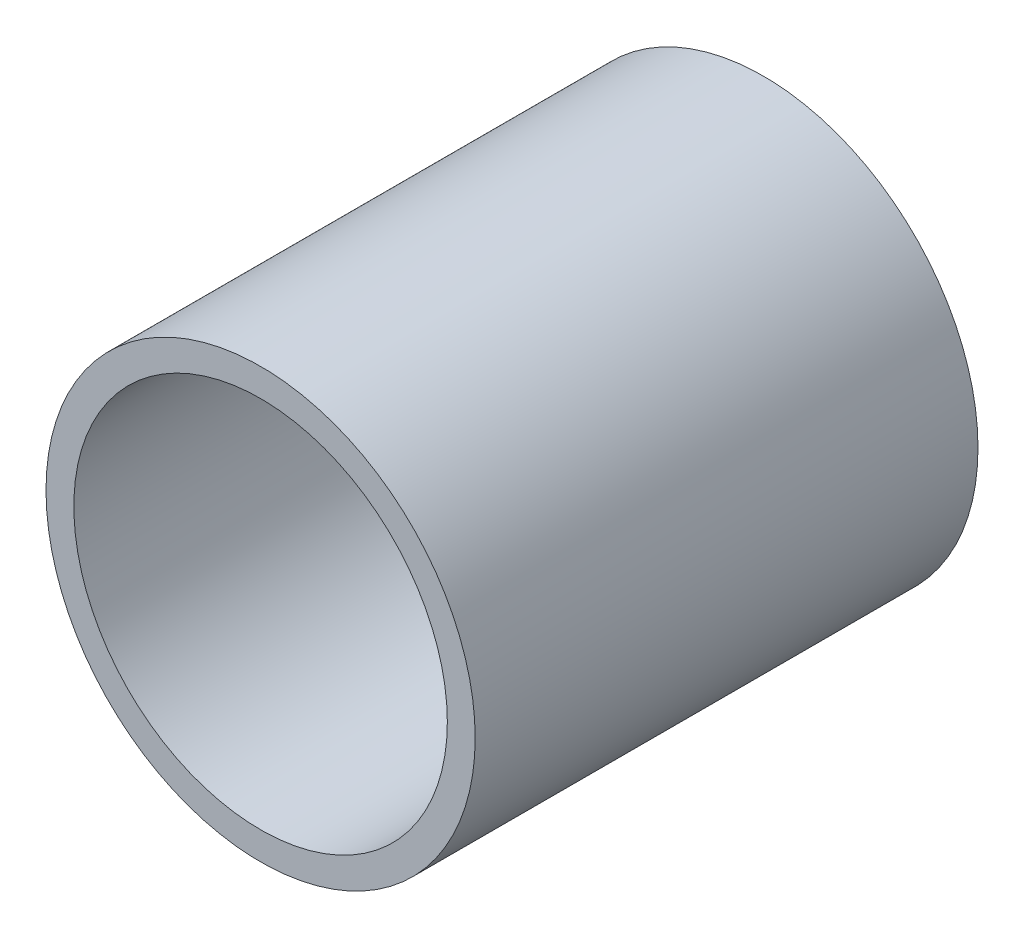
ISO-10303-21;
HEADER;
FILE_DESCRIPTION(('STEP AP214'),'2;1');
FILE_NAME('part.step','',(''),(''),'','','');
FILE_SCHEMA(('AUTOMOTIVE_DESIGN { 1 0 10303 214 1 1 1 1 }'));
ENDSEC;
DATA;
#1=APPLICATION_CONTEXT('core data for automotive mechanical design processes');
#2=APPLICATION_PROTOCOL_DEFINITION('international standard','automotive_design',2000,#1);
#3=PRODUCT_CONTEXT('',#1,'mechanical');
#4=PRODUCT('Part','Part','',(#3));
#5=PRODUCT_RELATED_PRODUCT_CATEGORY('part','',(#4));
#6=PRODUCT_DEFINITION_FORMATION('','',#4);
#7=PRODUCT_DEFINITION_CONTEXT('part definition',#1,'design');
#8=PRODUCT_DEFINITION('design','',#6,#7);
#9=PRODUCT_DEFINITION_SHAPE('','',#8);
#10=(LENGTH_UNIT() NAMED_UNIT(*) SI_UNIT(.MILLI.,.METRE.));
#11=(NAMED_UNIT(*) PLANE_ANGLE_UNIT() SI_UNIT($,.RADIAN.));
#12=(NAMED_UNIT(*) SI_UNIT($,.STERADIAN.) SOLID_ANGLE_UNIT());
#13=UNCERTAINTY_MEASURE_WITH_UNIT(LENGTH_MEASURE(1.E-05),#10,'distance_accuracy_value','');
#14=(GEOMETRIC_REPRESENTATION_CONTEXT(3) GLOBAL_UNCERTAINTY_ASSIGNED_CONTEXT((#13)) GLOBAL_UNIT_ASSIGNED_CONTEXT((#10,
#11,#12)) REPRESENTATION_CONTEXT('',''));
#15=CARTESIAN_POINT('',(0.,0.,0.));
#16=DIRECTION('',(0.,0.,1.));
#17=DIRECTION('',(1.,0.,0.));
#18=AXIS2_PLACEMENT_3D('',#15,#16,#17);
#19=CARTESIAN_POINT('',(0.,0.,17.77));
#20=DIRECTION('',(0.,0.,1.));
#21=DIRECTION('',(1.,0.,0.));
#22=AXIS2_PLACEMENT_3D('',#19,#20,#21);
#23=PLANE('',#22);
#24=CARTESIAN_POINT('',(0.,0.,17.77));
#25=DIRECTION('',(0.,0.,1.));
#26=DIRECTION('',(1.,0.,0.));
#27=AXIS2_PLACEMENT_3D('',#24,#25,#26);
#28=CIRCLE('',#27,7.584);
#29=CARTESIAN_POINT('',(7.584,0.,17.77));
#30=VERTEX_POINT('',#29);
#31=EDGE_CURVE('E10',#30,#30,#28,.T.);
#32=ORIENTED_EDGE('',*,*,#31,.T.);
#33=EDGE_LOOP('',(#32));
#34=FACE_BOUND('',#33,.T.);
#35=CARTESIAN_POINT('',(0.,0.,17.77));
#36=DIRECTION('',(0.,0.,1.));
#37=DIRECTION('',(1.,0.,0.));
#38=AXIS2_PLACEMENT_3D('',#35,#36,#37);
#39=CIRCLE('',#38,6.6);
#40=CARTESIAN_POINT('',(6.6,0.,17.77));
#41=VERTEX_POINT('',#40);
#42=EDGE_CURVE('E54',#41,#41,#39,.T.);
#43=ORIENTED_EDGE('',*,*,#42,.F.);
#44=EDGE_LOOP('',(#43));
#45=FACE_BOUND('',#44,.T.);
#46=ADVANCED_FACE('F41',(#34,#45),#23,.T.);
#47=CARTESIAN_POINT('',(0.,0.,0.));
#48=DIRECTION('',(0.,0.,1.));
#49=DIRECTION('',(1.,0.,0.));
#50=AXIS2_PLACEMENT_3D('',#47,#48,#49);
#51=PLANE('',#50);
#52=CARTESIAN_POINT('',(0.,0.,0.));
#53=DIRECTION('',(0.,0.,1.));
#54=DIRECTION('',(1.,0.,0.));
#55=AXIS2_PLACEMENT_3D('',#52,#53,#54);
#56=CIRCLE('',#55,7.584);
#57=CARTESIAN_POINT('',(7.584,0.,0.));
#58=VERTEX_POINT('',#57);
#59=EDGE_CURVE('E45',#58,#58,#56,.T.);
#60=ORIENTED_EDGE('',*,*,#59,.F.);
#61=EDGE_LOOP('',(#60));
#62=FACE_BOUND('',#61,.T.);
#63=CARTESIAN_POINT('',(0.,0.,0.));
#64=DIRECTION('',(0.,0.,1.));
#65=DIRECTION('',(1.,0.,0.));
#66=AXIS2_PLACEMENT_3D('',#63,#64,#65);
#67=CIRCLE('',#66,6.6);
#68=CARTESIAN_POINT('',(6.6,0.,0.));
#69=VERTEX_POINT('',#68);
#70=EDGE_CURVE('E56',#69,#69,#67,.T.);
#71=ORIENTED_EDGE('',*,*,#70,.T.);
#72=EDGE_LOOP('',(#71));
#73=FACE_BOUND('',#72,.T.);
#74=ADVANCED_FACE('F68',(#62,#73),#51,.F.);
#75=CARTESIAN_POINT('',(0.,0.,17.77));
#76=DIRECTION('',(0.,0.,-1.));
#77=DIRECTION('',(-1.,0.,0.));
#78=AXIS2_PLACEMENT_3D('',#75,#76,#77);
#79=CYLINDRICAL_SURFACE('',#78,7.584);
#80=ORIENTED_EDGE('',*,*,#31,.F.);
#81=EDGE_LOOP('',(#80));
#82=FACE_BOUND('',#81,.T.);
#83=ORIENTED_EDGE('',*,*,#59,.T.);
#84=EDGE_LOOP('',(#83));
#85=FACE_BOUND('',#84,.T.);
#86=ADVANCED_FACE('F43',(#82,#85),#79,.T.);
#87=CARTESIAN_POINT('',(0.,0.,17.77));
#88=DIRECTION('',(0.,0.,-1.));
#89=DIRECTION('',(-1.,0.,0.));
#90=AXIS2_PLACEMENT_3D('',#87,#88,#89);
#91=CYLINDRICAL_SURFACE('',#90,6.6);
#92=ORIENTED_EDGE('',*,*,#42,.T.);
#93=EDGE_LOOP('',(#92));
#94=FACE_BOUND('',#93,.T.);
#95=ORIENTED_EDGE('',*,*,#70,.F.);
#96=EDGE_LOOP('',(#95));
#97=FACE_BOUND('',#96,.T.);
#98=ADVANCED_FACE('F64',(#94,#97),#91,.F.);
#99=CLOSED_SHELL('',(#46,#74,#86,#98));
#100=MANIFOLD_SOLID_BREP('B2',#99);
#101=ADVANCED_BREP_SHAPE_REPRESENTATION('',(#18,#100),#14);
#102=SHAPE_DEFINITION_REPRESENTATION(#9,#101);
ENDSEC;
END-ISO-10303-21;
